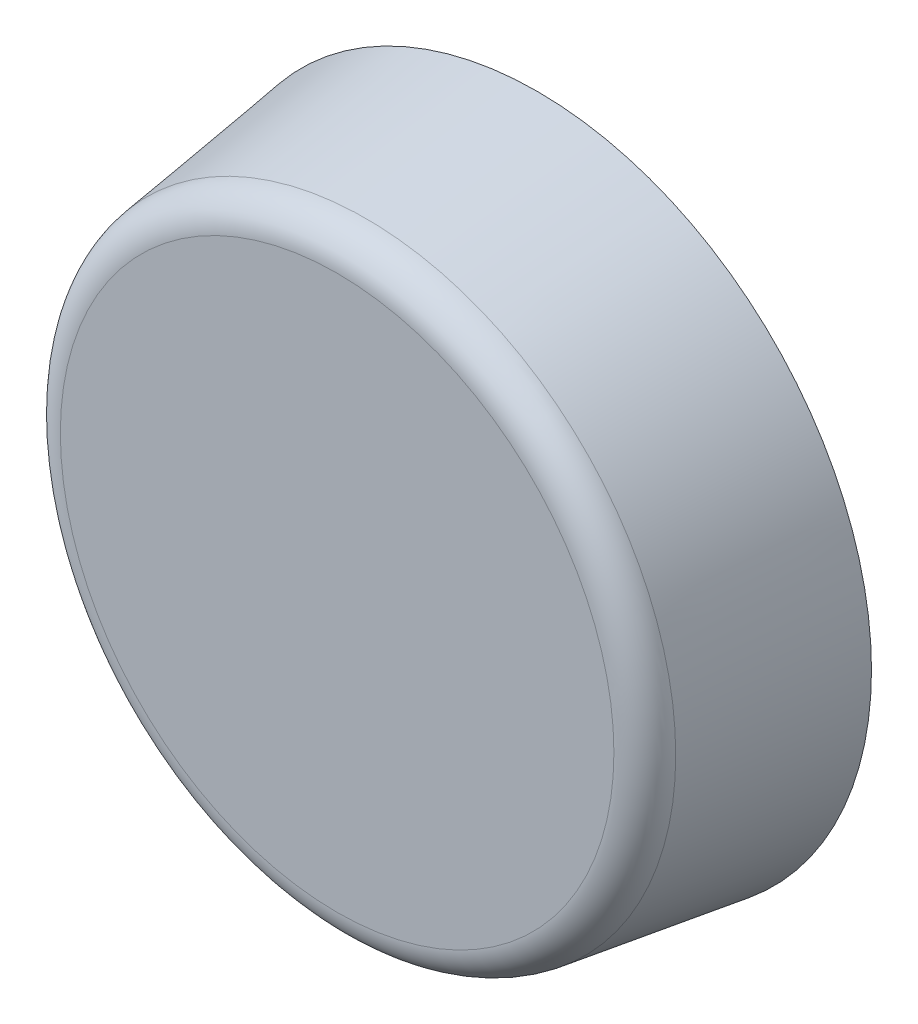
ISO-10303-21;
HEADER;
FILE_DESCRIPTION(('STEP AP214'),'2;1');
FILE_NAME('part.step','',(''),(''),'','','');
FILE_SCHEMA(('AUTOMOTIVE_DESIGN { 1 0 10303 214 1 1 1 1 }'));
ENDSEC;
DATA;
#1=APPLICATION_CONTEXT('core data for automotive mechanical design processes');
#2=APPLICATION_PROTOCOL_DEFINITION('international standard','automotive_design',2000,#1);
#3=PRODUCT_CONTEXT('',#1,'mechanical');
#4=PRODUCT('Part','Part','',(#3));
#5=PRODUCT_RELATED_PRODUCT_CATEGORY('part','',(#4));
#6=PRODUCT_DEFINITION_FORMATION('','',#4);
#7=PRODUCT_DEFINITION_CONTEXT('part definition',#1,'design');
#8=PRODUCT_DEFINITION('design','',#6,#7);
#9=PRODUCT_DEFINITION_SHAPE('','',#8);
#10=(LENGTH_UNIT() NAMED_UNIT(*) SI_UNIT(.MILLI.,.METRE.));
#11=(NAMED_UNIT(*) PLANE_ANGLE_UNIT() SI_UNIT($,.RADIAN.));
#12=(NAMED_UNIT(*) SI_UNIT($,.STERADIAN.) SOLID_ANGLE_UNIT());
#13=UNCERTAINTY_MEASURE_WITH_UNIT(LENGTH_MEASURE(1.E-05),#10,'distance_accuracy_value','');
#14=(GEOMETRIC_REPRESENTATION_CONTEXT(3) GLOBAL_UNCERTAINTY_ASSIGNED_CONTEXT((#13)) GLOBAL_UNIT_ASSIGNED_CONTEXT((#10,
#11,#12)) REPRESENTATION_CONTEXT('',''));
#15=CARTESIAN_POINT('',(0.,0.,0.));
#16=DIRECTION('',(0.,0.,1.));
#17=DIRECTION('',(1.,0.,0.));
#18=AXIS2_PLACEMENT_3D('',#15,#16,#17);
#19=CARTESIAN_POINT('',(0.,0.,2.));
#20=DIRECTION('',(0.,0.,-1.));
#21=DIRECTION('',(-1.,0.,0.));
#22=AXIS2_PLACEMENT_3D('',#19,#20,#21);
#23=CYLINDRICAL_SURFACE('',#22,4.05);
#24=CARTESIAN_POINT('',(0.,0.,2.));
#25=DIRECTION('',(0.,0.,1.));
#26=DIRECTION('',(1.,0.,0.));
#27=AXIS2_PLACEMENT_3D('',#24,#25,#26);
#28=CIRCLE('',#27,4.05);
#29=CARTESIAN_POINT('',(4.05,0.,2.));
#30=VERTEX_POINT('',#29);
#31=EDGE_CURVE('E48',#30,#30,#28,.T.);
#32=ORIENTED_EDGE('',*,*,#31,.F.);
#33=EDGE_LOOP('',(#32));
#34=FACE_BOUND('',#33,.T.);
#35=CARTESIAN_POINT('',(0.,0.,0.));
#36=DIRECTION('',(0.,0.,1.));
#37=DIRECTION('',(1.,0.,0.));
#38=AXIS2_PLACEMENT_3D('',#35,#36,#37);
#39=CIRCLE('',#38,4.05);
#40=CARTESIAN_POINT('',(4.05,0.,0.));
#41=VERTEX_POINT('',#40);
#42=EDGE_CURVE('E52',#41,#41,#39,.T.);
#43=ORIENTED_EDGE('',*,*,#42,.T.);
#44=EDGE_LOOP('',(#43));
#45=FACE_BOUND('',#44,.T.);
#46=ADVANCED_FACE('F37',(#34,#45),#23,.T.);
#47=CARTESIAN_POINT('',(0.,0.,0.));
#48=DIRECTION('',(0.,0.,1.));
#49=DIRECTION('',(1.,0.,0.));
#50=AXIS2_PLACEMENT_3D('',#47,#48,#49);
#51=PLANE('',#50);
#52=ORIENTED_EDGE('',*,*,#42,.F.);
#53=EDGE_LOOP('',(#52));
#54=FACE_BOUND('',#53,.T.);
#55=ADVANCED_FACE('F78',(#54),#51,.F.);
#56=CARTESIAN_POINT('',(0.,0.,2.));
#57=DIRECTION('',(0.,0.,-1.));
#58=DIRECTION('',(1.,0.,0.));
#59=AXIS2_PLACEMENT_3D('',#56,#57,#58);
#60=CONICAL_SURFACE('',#59,10.,0.139626340159546);
#61=CARTESIAN_POINT('',(0.,0.,7.13917310096007));
#62=DIRECTION('',(0.,0.,-1.));
#63=DIRECTION('',(-1.,0.,0.));
#64=AXIS2_PLACEMENT_3D('',#61,#62,#63);
#65=CIRCLE('',#64,9.27773632271099);
#66=CARTESIAN_POINT('',(-9.27773632271099,0.,7.13917310096007));
#67=VERTEX_POINT('',#66);
#68=EDGE_CURVE('E10',#67,#67,#65,.T.);
#69=ORIENTED_EDGE('',*,*,#68,.T.);
#70=EDGE_LOOP('',(#69));
#71=FACE_BOUND('',#70,.T.);
#72=CARTESIAN_POINT('',(0.,0.,2.));
#73=DIRECTION('',(0.,0.,1.));
#74=DIRECTION('',(1.,0.,0.));
#75=AXIS2_PLACEMENT_3D('',#72,#73,#74);
#76=CIRCLE('',#75,10.);
#77=CARTESIAN_POINT('',(10.,0.,2.));
#78=VERTEX_POINT('',#77);
#79=EDGE_CURVE('E56',#78,#78,#76,.T.);
#80=ORIENTED_EDGE('',*,*,#79,.T.);
#81=EDGE_LOOP('',(#80));
#82=FACE_BOUND('',#81,.T.);
#83=ADVANCED_FACE('F61',(#71,#82),#60,.T.);
#84=CARTESIAN_POINT('',(0.,0.,8.));
#85=DIRECTION('',(0.,0.,1.));
#86=DIRECTION('',(1.,0.,0.));
#87=AXIS2_PLACEMENT_3D('',#84,#85,#86);
#88=PLANE('',#87);
#89=CARTESIAN_POINT('',(0.,0.,8.));
#90=DIRECTION('',(0.,0.,1.));
#91=DIRECTION('',(1.,0.,0.));
#92=AXIS2_PLACEMENT_3D('',#89,#90,#91);
#93=CIRCLE('',#92,8.28746825396942);
#94=CARTESIAN_POINT('',(8.28746825396942,0.,8.));
#95=VERTEX_POINT('',#94);
#96=EDGE_CURVE('E44',#95,#95,#93,.T.);
#97=ORIENTED_EDGE('',*,*,#96,.T.);
#98=EDGE_LOOP('',(#97));
#99=FACE_BOUND('',#98,.T.);
#100=ADVANCED_FACE('F65',(#99),#88,.T.);
#101=CARTESIAN_POINT('',(0.,0.,2.));
#102=DIRECTION('',(0.,0.,1.));
#103=DIRECTION('',(1.,0.,0.));
#104=AXIS2_PLACEMENT_3D('',#101,#102,#103);
#105=PLANE('',#104);
#106=ORIENTED_EDGE('',*,*,#31,.T.);
#107=EDGE_LOOP('',(#106));
#108=FACE_BOUND('',#107,.T.);
#109=ORIENTED_EDGE('',*,*,#79,.F.);
#110=EDGE_LOOP('',(#109));
#111=FACE_BOUND('',#110,.T.);
#112=ADVANCED_FACE('F63',(#108,#111),#105,.F.);
#113=CARTESIAN_POINT('',(0.,0.,7.));
#114=DIRECTION('',(0.,0.,1.));
#115=DIRECTION('',(1.,0.,0.));
#116=AXIS2_PLACEMENT_3D('',#113,#114,#115);
#117=TOROIDAL_SURFACE('',#116,8.28746825396942,1.);
#118=ORIENTED_EDGE('',*,*,#68,.F.);
#119=EDGE_LOOP('',(#118));
#120=FACE_BOUND('',#119,.T.);
#121=ORIENTED_EDGE('',*,*,#96,.F.);
#122=EDGE_LOOP('',(#121));
#123=FACE_BOUND('',#122,.T.);
#124=ADVANCED_FACE('F39',(#120,#123),#117,.T.);
#125=CLOSED_SHELL('',(#46,#55,#83,#100,#112,#124));
#126=MANIFOLD_SOLID_BREP('B2',#125);
#127=ADVANCED_BREP_SHAPE_REPRESENTATION('',(#18,#126),#14);
#128=SHAPE_DEFINITION_REPRESENTATION(#9,#127);
ENDSEC;
END-ISO-10303-21;
